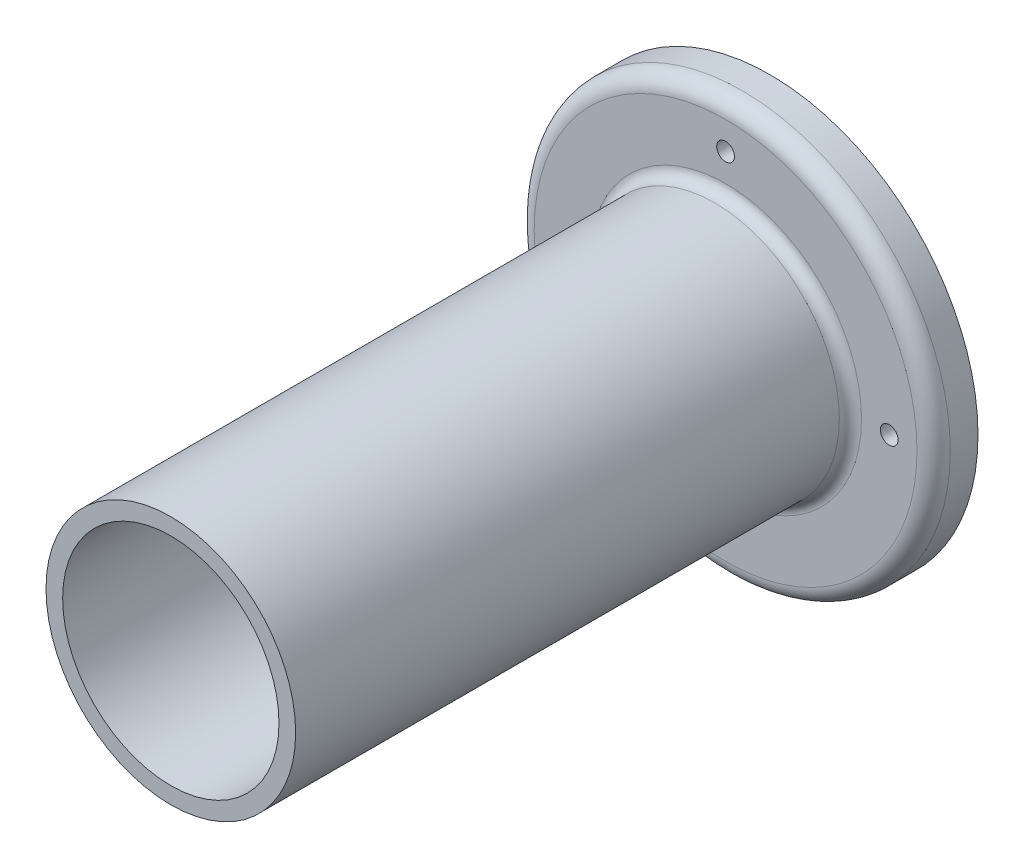
ISO-10303-21;
HEADER;
FILE_DESCRIPTION(('STEP AP214'),'2;1');
FILE_NAME('part.step','',(''),(''),'','','');
FILE_SCHEMA(('AUTOMOTIVE_DESIGN { 1 0 10303 214 1 1 1 1 }'));
ENDSEC;
DATA;
#1=APPLICATION_CONTEXT('core data for automotive mechanical design processes');
#2=APPLICATION_PROTOCOL_DEFINITION('international standard','automotive_design',2000,#1);
#3=PRODUCT_CONTEXT('',#1,'mechanical');
#4=PRODUCT('Part','Part','',(#3));
#5=PRODUCT_RELATED_PRODUCT_CATEGORY('part','',(#4));
#6=PRODUCT_DEFINITION_FORMATION('','',#4);
#7=PRODUCT_DEFINITION_CONTEXT('part definition',#1,'design');
#8=PRODUCT_DEFINITION('design','',#6,#7);
#9=PRODUCT_DEFINITION_SHAPE('','',#8);
#10=(LENGTH_UNIT() NAMED_UNIT(*) SI_UNIT(.MILLI.,.METRE.));
#11=(NAMED_UNIT(*) PLANE_ANGLE_UNIT() SI_UNIT($,.RADIAN.));
#12=(NAMED_UNIT(*) SI_UNIT($,.STERADIAN.) SOLID_ANGLE_UNIT());
#13=UNCERTAINTY_MEASURE_WITH_UNIT(LENGTH_MEASURE(1.E-05),#10,'distance_accuracy_value','');
#14=(GEOMETRIC_REPRESENTATION_CONTEXT(3) GLOBAL_UNCERTAINTY_ASSIGNED_CONTEXT((#13)) GLOBAL_UNIT_ASSIGNED_CONTEXT((#10,
#11,#12)) REPRESENTATION_CONTEXT('',''));
#15=CARTESIAN_POINT('',(0.,0.,0.));
#16=DIRECTION('',(0.,0.,1.));
#17=DIRECTION('',(1.,0.,0.));
#18=AXIS2_PLACEMENT_3D('',#15,#16,#17);
#19=CARTESIAN_POINT('',(0.,0.,8.));
#20=DIRECTION('',(0.,0.,1.));
#21=DIRECTION('',(1.,0.,0.));
#22=AXIS2_PLACEMENT_3D('',#19,#20,#21);
#23=PLANE('',#22);
#24=CARTESIAN_POINT('',(0.,0.,8.));
#25=DIRECTION('',(0.,0.,1.));
#26=DIRECTION('',(1.,0.,0.));
#27=AXIS2_PLACEMENT_3D('',#24,#25,#26);
#28=CIRCLE('',#27,24.5);
#29=CARTESIAN_POINT('',(24.5,0.,8.));
#30=VERTEX_POINT('',#29);
#31=EDGE_CURVE('E10',#30,#30,#28,.F.);
#32=ORIENTED_EDGE('',*,*,#31,.T.);
#33=EDGE_LOOP('',(#32));
#34=FACE_BOUND('',#33,.T.);
#35=CARTESIAN_POINT('',(0.,0.,8.));
#36=DIRECTION('',(0.,0.,1.));
#37=DIRECTION('',(1.,0.,0.));
#38=AXIS2_PLACEMENT_3D('',#35,#36,#37);
#39=CIRCLE('',#38,34.5);
#40=CARTESIAN_POINT('',(34.5,0.,8.));
#41=VERTEX_POINT('',#40);
#42=EDGE_CURVE('E51',#41,#41,#39,.T.);
#43=ORIENTED_EDGE('',*,*,#42,.T.);
#44=EDGE_LOOP('',(#43));
#45=FACE_BOUND('',#44,.T.);
#46=CARTESIAN_POINT('',(8.36634074168176E-13,-29.5,8.));
#47=DIRECTION('',(0.,0.,1.));
#48=DIRECTION('',(1.,0.,0.));
#49=AXIS2_PLACEMENT_3D('',#46,#47,#48);
#50=CIRCLE('',#49,1.6);
#51=CARTESIAN_POINT('',(1.60000000000084,-29.5,8.));
#52=VERTEX_POINT('',#51);
#53=EDGE_CURVE('E67',#52,#52,#50,.T.);
#54=ORIENTED_EDGE('',*,*,#53,.F.);
#55=EDGE_LOOP('',(#54));
#56=FACE_BOUND('',#55,.T.);
#57=CARTESIAN_POINT('',(0.,29.5,8.));
#58=DIRECTION('',(0.,0.,1.));
#59=DIRECTION('',(1.,0.,0.));
#60=AXIS2_PLACEMENT_3D('',#57,#58,#59);
#61=CIRCLE('',#60,1.6);
#62=CARTESIAN_POINT('',(1.6,29.5,8.));
#63=VERTEX_POINT('',#62);
#64=EDGE_CURVE('E57',#63,#63,#61,.T.);
#65=ORIENTED_EDGE('',*,*,#64,.F.);
#66=EDGE_LOOP('',(#65));
#67=FACE_BOUND('',#66,.T.);
#68=CARTESIAN_POINT('',(29.5000000000004,4.18317037084088E-13,8.));
#69=DIRECTION('',(0.,0.,1.));
#70=DIRECTION('',(1.,0.,0.));
#71=AXIS2_PLACEMENT_3D('',#68,#69,#70);
#72=CIRCLE('',#71,1.6);
#73=CARTESIAN_POINT('',(31.1000000000004,4.18317037084088E-13,8.));
#74=VERTEX_POINT('',#73);
#75=EDGE_CURVE('E61',#74,#74,#72,.T.);
#76=ORIENTED_EDGE('',*,*,#75,.F.);
#77=EDGE_LOOP('',(#76));
#78=FACE_BOUND('',#77,.T.);
#79=CARTESIAN_POINT('',(-29.4999999999996,-4.21929745141573E-13,8.));
#80=DIRECTION('',(0.,0.,1.));
#81=DIRECTION('',(1.,0.,0.));
#82=AXIS2_PLACEMENT_3D('',#79,#80,#81);
#83=CIRCLE('',#82,1.6);
#84=CARTESIAN_POINT('',(-27.8999999999996,-4.21929745141573E-13,8.));
#85=VERTEX_POINT('',#84);
#86=EDGE_CURVE('E73',#85,#85,#83,.T.);
#87=ORIENTED_EDGE('',*,*,#86,.F.);
#88=EDGE_LOOP('',(#87));
#89=FACE_BOUND('',#88,.T.);
#90=ADVANCED_FACE('F31',(#34,#45,#56,#67,#78,#89),#23,.T.);
#91=CARTESIAN_POINT('',(0.,0.,0.));
#92=DIRECTION('',(0.,0.,1.));
#93=DIRECTION('',(1.,0.,0.));
#94=AXIS2_PLACEMENT_3D('',#91,#92,#93);
#95=PLANE('',#94);
#96=CARTESIAN_POINT('',(0.,0.,0.));
#97=DIRECTION('',(0.,0.,1.));
#98=DIRECTION('',(1.,0.,0.));
#99=AXIS2_PLACEMENT_3D('',#96,#97,#98);
#100=CIRCLE('',#99,37.5);
#101=CARTESIAN_POINT('',(37.5,0.,0.));
#102=VERTEX_POINT('',#101);
#103=EDGE_CURVE('E54',#102,#102,#100,.T.);
#104=ORIENTED_EDGE('',*,*,#103,.F.);
#105=EDGE_LOOP('',(#104));
#106=FACE_BOUND('',#105,.T.);
#107=CARTESIAN_POINT('',(0.,29.5,0.));
#108=DIRECTION('',(0.,0.,1.));
#109=DIRECTION('',(1.,0.,0.));
#110=AXIS2_PLACEMENT_3D('',#107,#108,#109);
#111=CIRCLE('',#110,1.6);
#112=CARTESIAN_POINT('',(1.6,29.5,0.));
#113=VERTEX_POINT('',#112);
#114=EDGE_CURVE('E58',#113,#113,#111,.T.);
#115=ORIENTED_EDGE('',*,*,#114,.T.);
#116=EDGE_LOOP('',(#115));
#117=FACE_BOUND('',#116,.T.);
#118=CARTESIAN_POINT('',(29.5000000000004,4.18317037084088E-13,0.));
#119=DIRECTION('',(0.,0.,1.));
#120=DIRECTION('',(1.,0.,0.));
#121=AXIS2_PLACEMENT_3D('',#118,#119,#120);
#122=CIRCLE('',#121,1.6);
#123=CARTESIAN_POINT('',(31.1000000000004,4.18317037084088E-13,0.));
#124=VERTEX_POINT('',#123);
#125=EDGE_CURVE('E64',#124,#124,#122,.T.);
#126=ORIENTED_EDGE('',*,*,#125,.T.);
#127=EDGE_LOOP('',(#126));
#128=FACE_BOUND('',#127,.T.);
#129=CARTESIAN_POINT('',(8.36634074168176E-13,-29.5,0.));
#130=DIRECTION('',(0.,0.,1.));
#131=DIRECTION('',(1.,0.,0.));
#132=AXIS2_PLACEMENT_3D('',#129,#130,#131);
#133=CIRCLE('',#132,1.6);
#134=CARTESIAN_POINT('',(1.60000000000084,-29.5,0.));
#135=VERTEX_POINT('',#134);
#136=EDGE_CURVE('E70',#135,#135,#133,.T.);
#137=ORIENTED_EDGE('',*,*,#136,.T.);
#138=EDGE_LOOP('',(#137));
#139=FACE_BOUND('',#138,.T.);
#140=CARTESIAN_POINT('',(-29.4999999999996,-4.21929745141573E-13,0.));
#141=DIRECTION('',(0.,0.,1.));
#142=DIRECTION('',(1.,0.,0.));
#143=AXIS2_PLACEMENT_3D('',#140,#141,#142);
#144=CIRCLE('',#143,1.6);
#145=CARTESIAN_POINT('',(-27.8999999999996,-4.21929745141573E-13,0.));
#146=VERTEX_POINT('',#145);
#147=EDGE_CURVE('E76',#146,#146,#144,.T.);
#148=ORIENTED_EDGE('',*,*,#147,.T.);
#149=EDGE_LOOP('',(#148));
#150=FACE_BOUND('',#149,.T.);
#151=ADVANCED_FACE('F106',(#106,#117,#128,#139,#150),#95,.F.);
#152=CARTESIAN_POINT('',(0.,0.,8.));
#153=DIRECTION('',(0.,0.,-1.));
#154=DIRECTION('',(-1.,0.,0.));
#155=AXIS2_PLACEMENT_3D('',#152,#153,#154);
#156=CYLINDRICAL_SURFACE('',#155,37.5);
#157=CARTESIAN_POINT('',(0.,0.,5.));
#158=DIRECTION('',(0.,0.,1.));
#159=DIRECTION('',(1.,0.,0.));
#160=AXIS2_PLACEMENT_3D('',#157,#158,#159);
#161=CIRCLE('',#160,37.5);
#162=CARTESIAN_POINT('',(37.5,0.,5.));
#163=VERTEX_POINT('',#162);
#164=EDGE_CURVE('E46',#163,#163,#161,.F.);
#165=ORIENTED_EDGE('',*,*,#164,.T.);
#166=EDGE_LOOP('',(#165));
#167=FACE_BOUND('',#166,.T.);
#168=ORIENTED_EDGE('',*,*,#103,.T.);
#169=EDGE_LOOP('',(#168));
#170=FACE_BOUND('',#169,.T.);
#171=ADVANCED_FACE('F112',(#167,#170),#156,.T.);
#172=CARTESIAN_POINT('',(0.,29.5,8.));
#173=DIRECTION('',(0.,0.,-1.));
#174=DIRECTION('',(-1.,0.,0.));
#175=AXIS2_PLACEMENT_3D('',#172,#173,#174);
#176=CYLINDRICAL_SURFACE('',#175,1.6);
#177=ORIENTED_EDGE('',*,*,#64,.T.);
#178=EDGE_LOOP('',(#177));
#179=FACE_BOUND('',#178,.T.);
#180=ORIENTED_EDGE('',*,*,#114,.F.);
#181=EDGE_LOOP('',(#180));
#182=FACE_BOUND('',#181,.T.);
#183=ADVANCED_FACE('F169',(#179,#182),#176,.F.);
#184=CARTESIAN_POINT('',(29.5000000000004,4.18317037084088E-13,8.));
#185=DIRECTION('',(0.,0.,-1.));
#186=DIRECTION('',(-1.,0.,0.));
#187=AXIS2_PLACEMENT_3D('',#184,#185,#186);
#188=CYLINDRICAL_SURFACE('',#187,1.6);
#189=ORIENTED_EDGE('',*,*,#75,.T.);
#190=EDGE_LOOP('',(#189));
#191=FACE_BOUND('',#190,.T.);
#192=ORIENTED_EDGE('',*,*,#125,.F.);
#193=EDGE_LOOP('',(#192));
#194=FACE_BOUND('',#193,.T.);
#195=ADVANCED_FACE('F189',(#191,#194),#188,.F.);
#196=CARTESIAN_POINT('',(8.36634074168176E-13,-29.5,8.));
#197=DIRECTION('',(0.,0.,-1.));
#198=DIRECTION('',(-1.,0.,0.));
#199=AXIS2_PLACEMENT_3D('',#196,#197,#198);
#200=CYLINDRICAL_SURFACE('',#199,1.6);
#201=ORIENTED_EDGE('',*,*,#53,.T.);
#202=EDGE_LOOP('',(#201));
#203=FACE_BOUND('',#202,.T.);
#204=ORIENTED_EDGE('',*,*,#136,.F.);
#205=EDGE_LOOP('',(#204));
#206=FACE_BOUND('',#205,.T.);
#207=ADVANCED_FACE('F179',(#203,#206),#200,.F.);
#208=CARTESIAN_POINT('',(-29.4999999999996,-4.21929745141573E-13,8.));
#209=DIRECTION('',(0.,0.,-1.));
#210=DIRECTION('',(-1.,0.,0.));
#211=AXIS2_PLACEMENT_3D('',#208,#209,#210);
#212=CYLINDRICAL_SURFACE('',#211,1.6);
#213=ORIENTED_EDGE('',*,*,#86,.T.);
#214=EDGE_LOOP('',(#213));
#215=FACE_BOUND('',#214,.T.);
#216=ORIENTED_EDGE('',*,*,#147,.F.);
#217=EDGE_LOOP('',(#216));
#218=FACE_BOUND('',#217,.T.);
#219=ADVANCED_FACE('F102',(#215,#218),#212,.F.);
#220=CARTESIAN_POINT('',(0.,0.,5.));
#221=DIRECTION('',(0.,0.,1.));
#222=DIRECTION('',(1.,0.,0.));
#223=AXIS2_PLACEMENT_3D('',#220,#221,#222);
#224=TOROIDAL_SURFACE('',#223,34.5,3.);
#225=ORIENTED_EDGE('',*,*,#164,.F.);
#226=EDGE_LOOP('',(#225));
#227=FACE_BOUND('',#226,.T.);
#228=ORIENTED_EDGE('',*,*,#42,.F.);
#229=EDGE_LOOP('',(#228));
#230=FACE_BOUND('',#229,.T.);
#231=ADVANCED_FACE('F94',(#227,#230),#224,.T.);
#232=CARTESIAN_POINT('',(0.,0.,108.));
#233=DIRECTION('',(0.,0.,1.));
#234=DIRECTION('',(1.,0.,0.));
#235=AXIS2_PLACEMENT_3D('',#232,#233,#234);
#236=PLANE('',#235);
#237=CARTESIAN_POINT('',(0.,0.,108.));
#238=DIRECTION('',(0.,0.,1.));
#239=DIRECTION('',(1.,0.,0.));
#240=AXIS2_PLACEMENT_3D('',#237,#238,#239);
#241=CIRCLE('',#240,22.5);
#242=CARTESIAN_POINT('',(22.5,0.,108.));
#243=VERTEX_POINT('',#242);
#244=EDGE_CURVE('E79',#243,#243,#241,.T.);
#245=ORIENTED_EDGE('',*,*,#244,.T.);
#246=EDGE_LOOP('',(#245));
#247=FACE_BOUND('',#246,.T.);
#248=CARTESIAN_POINT('',(0.,0.,108.));
#249=DIRECTION('',(0.,0.,1.));
#250=DIRECTION('',(1.,0.,0.));
#251=AXIS2_PLACEMENT_3D('',#248,#249,#250);
#252=CIRCLE('',#251,19.5);
#253=CARTESIAN_POINT('',(19.5,0.,108.));
#254=VERTEX_POINT('',#253);
#255=EDGE_CURVE('E84',#254,#254,#252,.T.);
#256=ORIENTED_EDGE('',*,*,#255,.F.);
#257=EDGE_LOOP('',(#256));
#258=FACE_BOUND('',#257,.T.);
#259=ADVANCED_FACE('F91',(#247,#258),#236,.T.);
#260=CARTESIAN_POINT('',(0.,0.,108.));
#261=DIRECTION('',(0.,0.,-1.));
#262=DIRECTION('',(-1.,0.,0.));
#263=AXIS2_PLACEMENT_3D('',#260,#261,#262);
#264=CYLINDRICAL_SURFACE('',#263,22.5);
#265=CARTESIAN_POINT('',(0.,0.,9.99999999999999));
#266=DIRECTION('',(0.,0.,1.));
#267=DIRECTION('',(1.,0.,0.));
#268=AXIS2_PLACEMENT_3D('',#265,#266,#267);
#269=CIRCLE('',#268,22.5);
#270=CARTESIAN_POINT('',(22.5,0.,9.99999999999999));
#271=VERTEX_POINT('',#270);
#272=EDGE_CURVE('E38',#271,#271,#269,.T.);
#273=ORIENTED_EDGE('',*,*,#272,.T.);
#274=EDGE_LOOP('',(#273));
#275=FACE_BOUND('',#274,.T.);
#276=ORIENTED_EDGE('',*,*,#244,.F.);
#277=EDGE_LOOP('',(#276));
#278=FACE_BOUND('',#277,.T.);
#279=ADVANCED_FACE('F93',(#275,#278),#264,.T.);
#280=CARTESIAN_POINT('',(0.,0.,108.));
#281=DIRECTION('',(0.,0.,-1.));
#282=DIRECTION('',(-1.,0.,0.));
#283=AXIS2_PLACEMENT_3D('',#280,#281,#282);
#284=CYLINDRICAL_SURFACE('',#283,19.5);
#285=ORIENTED_EDGE('',*,*,#255,.T.);
#286=EDGE_LOOP('',(#285));
#287=FACE_BOUND('',#286,.T.);
#288=CARTESIAN_POINT('',(0.,0.,8.00000000000001));
#289=DIRECTION('',(0.,0.,1.));
#290=DIRECTION('',(1.,0.,0.));
#291=AXIS2_PLACEMENT_3D('',#288,#289,#290);
#292=CIRCLE('',#291,19.5);
#293=CARTESIAN_POINT('',(19.5,0.,8.00000000000001));
#294=VERTEX_POINT('',#293);
#295=EDGE_CURVE('E42',#294,#294,#292,.F.);
#296=ORIENTED_EDGE('',*,*,#295,.T.);
#297=EDGE_LOOP('',(#296));
#298=FACE_BOUND('',#297,.T.);
#299=ADVANCED_FACE('F88',(#287,#298),#284,.F.);
#300=ORIENTED_EDGE('',*,*,#295,.F.);
#301=EDGE_LOOP('',(#300));
#302=FACE_BOUND('',#301,.T.);
#303=ADVANCED_FACE('F108',(#302),#23,.T.);
#304=CARTESIAN_POINT('',(0.,0.,9.99999999999999));
#305=DIRECTION('',(0.,0.,1.));
#306=DIRECTION('',(1.,0.,0.));
#307=AXIS2_PLACEMENT_3D('',#304,#305,#306);
#308=TOROIDAL_SURFACE('',#307,24.5,2.);
#309=ORIENTED_EDGE('',*,*,#31,.F.);
#310=EDGE_LOOP('',(#309));
#311=FACE_BOUND('',#310,.T.);
#312=ORIENTED_EDGE('',*,*,#272,.F.);
#313=EDGE_LOOP('',(#312));
#314=FACE_BOUND('',#313,.T.);
#315=ADVANCED_FACE('F33',(#311,#314),#308,.F.);
#316=CLOSED_SHELL('',(#90,#151,#171,#183,#195,#207,#219,#231,#259,#279,#299,#303,#315));
#317=MANIFOLD_SOLID_BREP('B2',#316);
#318=ADVANCED_BREP_SHAPE_REPRESENTATION('',(#18,#317),#14);
#319=SHAPE_DEFINITION_REPRESENTATION(#9,#318);
ENDSEC;
END-ISO-10303-21;
